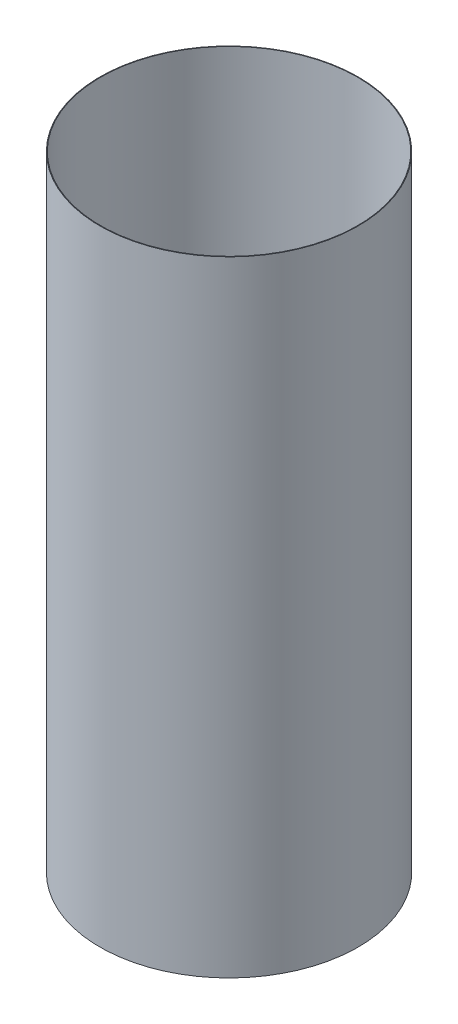
ISO-10303-21;
HEADER;
FILE_DESCRIPTION(('STEP AP214'),'2;1');
FILE_NAME('part.step','',(''),(''),'','','');
FILE_SCHEMA(('AUTOMOTIVE_DESIGN { 1 0 10303 214 1 1 1 1 }'));
ENDSEC;
DATA;
#1=APPLICATION_CONTEXT('core data for automotive mechanical design processes');
#2=APPLICATION_PROTOCOL_DEFINITION('international standard','automotive_design',2000,#1);
#3=PRODUCT_CONTEXT('',#1,'mechanical');
#4=PRODUCT('Part','Part','',(#3));
#5=PRODUCT_RELATED_PRODUCT_CATEGORY('part','',(#4));
#6=PRODUCT_DEFINITION_FORMATION('','',#4);
#7=PRODUCT_DEFINITION_CONTEXT('part definition',#1,'design');
#8=PRODUCT_DEFINITION('design','',#6,#7);
#9=PRODUCT_DEFINITION_SHAPE('','',#8);
#10=(LENGTH_UNIT() NAMED_UNIT(*) SI_UNIT(.MILLI.,.METRE.));
#11=(NAMED_UNIT(*) PLANE_ANGLE_UNIT() SI_UNIT($,.RADIAN.));
#12=(NAMED_UNIT(*) SI_UNIT($,.STERADIAN.) SOLID_ANGLE_UNIT());
#13=UNCERTAINTY_MEASURE_WITH_UNIT(LENGTH_MEASURE(1.E-05),#10,'distance_accuracy_value','');
#14=(GEOMETRIC_REPRESENTATION_CONTEXT(3) GLOBAL_UNCERTAINTY_ASSIGNED_CONTEXT((#13)) GLOBAL_UNIT_ASSIGNED_CONTEXT((#10,
#11,#12)) REPRESENTATION_CONTEXT('',''));
#15=CARTESIAN_POINT('',(0.,0.,0.));
#16=DIRECTION('',(0.,0.,1.));
#17=DIRECTION('',(1.,0.,0.));
#18=AXIS2_PLACEMENT_3D('',#15,#16,#17);
#19=CARTESIAN_POINT('',(0.,176.2125,0.));
#20=DIRECTION('',(0.,1.,0.));
#21=DIRECTION('',(0.,0.,1.));
#22=AXIS2_PLACEMENT_3D('',#19,#20,#21);
#23=PLANE('',#22);
#24=CARTESIAN_POINT('',(0.,176.2125,0.));
#25=DIRECTION('',(0.,1.,0.));
#26=DIRECTION('',(0.,0.,1.));
#27=AXIS2_PLACEMENT_3D('',#24,#25,#26);
#28=CIRCLE('',#27,36.449);
#29=CARTESIAN_POINT('',(0.,176.2125,-36.449));
#30=VERTEX_POINT('',#29);
#31=EDGE_CURVE('E10',#30,#30,#28,.T.);
#32=ORIENTED_EDGE('',*,*,#31,.T.);
#33=EDGE_LOOP('',(#32));
#34=FACE_BOUND('',#33,.T.);
#35=CARTESIAN_POINT('',(0.,176.2125,0.));
#36=DIRECTION('',(0.,1.,0.));
#37=DIRECTION('',(0.,0.,1.));
#38=AXIS2_PLACEMENT_3D('',#35,#36,#37);
#39=CIRCLE('',#38,36.2712);
#40=CARTESIAN_POINT('',(0.,176.2125,-36.2712));
#41=VERTEX_POINT('',#40);
#42=EDGE_CURVE('E42',#41,#41,#39,.T.);
#43=ORIENTED_EDGE('',*,*,#42,.F.);
#44=EDGE_LOOP('',(#43));
#45=FACE_BOUND('',#44,.T.);
#46=ADVANCED_FACE('F31',(#34,#45),#23,.T.);
#47=CARTESIAN_POINT('',(0.,0.,0.));
#48=DIRECTION('',(0.,1.,0.));
#49=DIRECTION('',(0.,0.,1.));
#50=AXIS2_PLACEMENT_3D('',#47,#48,#49);
#51=PLANE('',#50);
#52=CARTESIAN_POINT('',(0.,0.,0.));
#53=DIRECTION('',(0.,1.,0.));
#54=DIRECTION('',(0.,0.,1.));
#55=AXIS2_PLACEMENT_3D('',#52,#53,#54);
#56=CIRCLE('',#55,36.449);
#57=CARTESIAN_POINT('',(0.,0.,-36.449));
#58=VERTEX_POINT('',#57);
#59=EDGE_CURVE('E35',#58,#58,#56,.T.);
#60=ORIENTED_EDGE('',*,*,#59,.F.);
#61=EDGE_LOOP('',(#60));
#62=FACE_BOUND('',#61,.T.);
#63=CARTESIAN_POINT('',(0.,0.,0.));
#64=DIRECTION('',(0.,1.,0.));
#65=DIRECTION('',(0.,0.,1.));
#66=AXIS2_PLACEMENT_3D('',#63,#64,#65);
#67=CIRCLE('',#66,36.2712);
#68=CARTESIAN_POINT('',(0.,0.,-36.2712));
#69=VERTEX_POINT('',#68);
#70=EDGE_CURVE('E44',#69,#69,#67,.T.);
#71=ORIENTED_EDGE('',*,*,#70,.T.);
#72=EDGE_LOOP('',(#71));
#73=FACE_BOUND('',#72,.T.);
#74=ADVANCED_FACE('F54',(#62,#73),#51,.F.);
#75=CARTESIAN_POINT('',(0.,176.2125,0.));
#76=DIRECTION('',(0.,-1.,0.));
#77=DIRECTION('',(0.,0.,-1.));
#78=AXIS2_PLACEMENT_3D('',#75,#76,#77);
#79=CYLINDRICAL_SURFACE('',#78,36.449);
#80=CARTESIAN_POINT('',(0.,176.2125,-36.449));
#81=CARTESIAN_POINT('',(0.,174.376953125,-36.449));
#82=CARTESIAN_POINT('',(0.,172.54140625,-36.449));
#83=CARTESIAN_POINT('',(0.,168.8703125,-36.449));
#84=CARTESIAN_POINT('',(0.,167.034765625,-36.449));
#85=CARTESIAN_POINT('',(0.,163.363671875,-36.449));
#86=CARTESIAN_POINT('',(0.,161.528125,-36.449));
#87=CARTESIAN_POINT('',(0.,157.85703125,-36.449));
#88=CARTESIAN_POINT('',(0.,156.021484375,-36.449));
#89=CARTESIAN_POINT('',(0.,152.350390625,-36.449));
#90=CARTESIAN_POINT('',(0.,150.51484375,-36.449));
#91=CARTESIAN_POINT('',(0.,146.84375,-36.449));
#92=CARTESIAN_POINT('',(0.,145.008203125,-36.449));
#93=CARTESIAN_POINT('',(0.,141.337109375,-36.449));
#94=CARTESIAN_POINT('',(0.,139.5015625,-36.449));
#95=CARTESIAN_POINT('',(0.,135.83046875,-36.449));
#96=CARTESIAN_POINT('',(0.,133.994921875,-36.449));
#97=CARTESIAN_POINT('',(0.,130.323828125,-36.449));
#98=CARTESIAN_POINT('',(0.,128.48828125,-36.449));
#99=CARTESIAN_POINT('',(0.,124.8171875,-36.449));
#100=CARTESIAN_POINT('',(0.,122.981640625,-36.449));
#101=CARTESIAN_POINT('',(0.,119.310546875,-36.449));
#102=CARTESIAN_POINT('',(0.,117.475,-36.449));
#103=CARTESIAN_POINT('',(0.,113.80390625,-36.449));
#104=CARTESIAN_POINT('',(0.,111.968359375,-36.449));
#105=CARTESIAN_POINT('',(0.,108.297265625,-36.449));
#106=CARTESIAN_POINT('',(0.,106.46171875,-36.449));
#107=CARTESIAN_POINT('',(0.,102.790625,-36.449));
#108=CARTESIAN_POINT('',(0.,100.955078125,-36.449));
#109=CARTESIAN_POINT('',(0.,97.283984375,-36.449));
#110=CARTESIAN_POINT('',(0.,95.4484375,-36.449));
#111=CARTESIAN_POINT('',(0.,91.77734375,-36.449));
#112=CARTESIAN_POINT('',(0.,89.941796875,-36.449));
#113=CARTESIAN_POINT('',(0.,86.270703125,-36.449));
#114=CARTESIAN_POINT('',(0.,84.43515625,-36.449));
#115=CARTESIAN_POINT('',(0.,80.7640625,-36.449));
#116=CARTESIAN_POINT('',(0.,78.928515625,-36.449));
#117=CARTESIAN_POINT('',(0.,75.257421875,-36.449));
#118=CARTESIAN_POINT('',(0.,73.421875,-36.449));
#119=CARTESIAN_POINT('',(0.,69.75078125,-36.449));
#120=CARTESIAN_POINT('',(0.,67.915234375,-36.449));
#121=CARTESIAN_POINT('',(0.,64.244140625,-36.449));
#122=CARTESIAN_POINT('',(0.,62.40859375,-36.449));
#123=CARTESIAN_POINT('',(0.,58.7375,-36.449));
#124=CARTESIAN_POINT('',(0.,56.901953125,-36.449));
#125=CARTESIAN_POINT('',(0.,53.230859375,-36.449));
#126=CARTESIAN_POINT('',(0.,51.3953125,-36.449));
#127=CARTESIAN_POINT('',(0.,47.72421875,-36.449));
#128=CARTESIAN_POINT('',(0.,45.888671875,-36.449));
#129=CARTESIAN_POINT('',(0.,42.217578125,-36.449));
#130=CARTESIAN_POINT('',(0.,40.38203125,-36.449));
#131=CARTESIAN_POINT('',(0.,36.7109375,-36.449));
#132=CARTESIAN_POINT('',(0.,34.875390625,-36.449));
#133=CARTESIAN_POINT('',(0.,31.204296875,-36.449));
#134=CARTESIAN_POINT('',(0.,29.36875,-36.449));
#135=CARTESIAN_POINT('',(0.,25.69765625,-36.449));
#136=CARTESIAN_POINT('',(0.,23.862109375,-36.449));
#137=CARTESIAN_POINT('',(0.,20.191015625,-36.449));
#138=CARTESIAN_POINT('',(0.,18.35546875,-36.449));
#139=CARTESIAN_POINT('',(0.,14.684375,-36.449));
#140=CARTESIAN_POINT('',(0.,12.848828125,-36.449));
#141=CARTESIAN_POINT('',(0.,9.17773437499998,-36.449));
#142=CARTESIAN_POINT('',(0.,7.34218749999998,-36.449));
#143=CARTESIAN_POINT('',(0.,3.67109374999997,-36.449));
#144=CARTESIAN_POINT('',(0.,1.83554687499997,-36.449));
#145=CARTESIAN_POINT('',(0.,0.,-36.449));
#146=B_SPLINE_CURVE_WITH_KNOTS('',3,(#80,#81,#82,#83,#84,#85,#86,#87,#88,#89,#90,#91,#92,#93,
#94,#95,#96,#97,#98,#99,#100,#101,#102,#103,#104,#105,#106,#107,#108,#109,#110,#111,#112,#113,
#114,#115,#116,#117,#118,#119,#120,#121,#122,#123,#124,#125,#126,#127,#128,#129,#130,#131,#132,
#133,#134,#135,#136,#137,#138,#139,#140,#141,#142,#143,#144,#145),.UNSPECIFIED.,.F.,.F.,(4,2,2,
2,2,2,2,2,2,2,2,2,2,2,2,2,2,2,2,2,2,2,2,2,2,2,2,2,2,2,2,2,4),(0.,5.50664062499998,11.01328125,
16.519921875,22.0265625,27.533203125,33.03984375,38.546484375,44.053125,49.559765625,
55.06640625,60.573046875,66.0796875,71.586328125,77.09296875,82.599609375,88.10625,93.612890625,
99.11953125,104.626171875,110.1328125,115.639453125,121.14609375,126.652734375,132.159375,
137.666015625,143.17265625,148.679296875,154.1859375,159.692578125,165.19921875,170.705859375,
176.2125),.UNSPECIFIED.);
#147=EDGE_CURVE('BSEAM33',#30,#58,#146,.T.);
#148=ORIENTED_EDGE('',*,*,#31,.F.);
#149=ORIENTED_EDGE('',*,*,#59,.T.);
#150=ORIENTED_EDGE('',*,*,#147,.T.);
#151=ORIENTED_EDGE('',*,*,#147,.F.);
#152=EDGE_LOOP('',(#148,#150,#149,#151));
#153=FACE_BOUND('',#152,.T.);
#154=ADVANCED_FACE('F33',(#153),#79,.T.);
#155=CARTESIAN_POINT('',(0.,176.2125,0.));
#156=DIRECTION('',(0.,-1.,0.));
#157=DIRECTION('',(0.,0.,-1.));
#158=AXIS2_PLACEMENT_3D('',#155,#156,#157);
#159=CYLINDRICAL_SURFACE('',#158,36.2712);
#160=CARTESIAN_POINT('',(0.,176.2125,-36.2712));
#161=CARTESIAN_POINT('',(0.,174.376953125,-36.2712));
#162=CARTESIAN_POINT('',(0.,172.54140625,-36.2712));
#163=CARTESIAN_POINT('',(0.,168.8703125,-36.2712));
#164=CARTESIAN_POINT('',(0.,167.034765625,-36.2712));
#165=CARTESIAN_POINT('',(0.,163.363671875,-36.2712));
#166=CARTESIAN_POINT('',(0.,161.528125,-36.2712));
#167=CARTESIAN_POINT('',(0.,157.85703125,-36.2712));
#168=CARTESIAN_POINT('',(0.,156.021484375,-36.2712));
#169=CARTESIAN_POINT('',(0.,152.350390625,-36.2712));
#170=CARTESIAN_POINT('',(0.,150.51484375,-36.2712));
#171=CARTESIAN_POINT('',(0.,146.84375,-36.2712));
#172=CARTESIAN_POINT('',(0.,145.008203125,-36.2712));
#173=CARTESIAN_POINT('',(0.,141.337109375,-36.2712));
#174=CARTESIAN_POINT('',(0.,139.5015625,-36.2712));
#175=CARTESIAN_POINT('',(0.,135.83046875,-36.2712));
#176=CARTESIAN_POINT('',(0.,133.994921875,-36.2712));
#177=CARTESIAN_POINT('',(0.,130.323828125,-36.2712));
#178=CARTESIAN_POINT('',(0.,128.48828125,-36.2712));
#179=CARTESIAN_POINT('',(0.,124.8171875,-36.2712));
#180=CARTESIAN_POINT('',(0.,122.981640625,-36.2712));
#181=CARTESIAN_POINT('',(0.,119.310546875,-36.2712));
#182=CARTESIAN_POINT('',(0.,117.475,-36.2712));
#183=CARTESIAN_POINT('',(0.,113.80390625,-36.2712));
#184=CARTESIAN_POINT('',(0.,111.968359375,-36.2712));
#185=CARTESIAN_POINT('',(0.,108.297265625,-36.2712));
#186=CARTESIAN_POINT('',(0.,106.46171875,-36.2712));
#187=CARTESIAN_POINT('',(0.,102.790625,-36.2712));
#188=CARTESIAN_POINT('',(0.,100.955078125,-36.2712));
#189=CARTESIAN_POINT('',(0.,97.283984375,-36.2712));
#190=CARTESIAN_POINT('',(0.,95.4484375,-36.2712));
#191=CARTESIAN_POINT('',(0.,91.77734375,-36.2712));
#192=CARTESIAN_POINT('',(0.,89.941796875,-36.2712));
#193=CARTESIAN_POINT('',(0.,86.270703125,-36.2712));
#194=CARTESIAN_POINT('',(0.,84.43515625,-36.2712));
#195=CARTESIAN_POINT('',(0.,80.7640625,-36.2712));
#196=CARTESIAN_POINT('',(0.,78.928515625,-36.2712));
#197=CARTESIAN_POINT('',(0.,75.257421875,-36.2712));
#198=CARTESIAN_POINT('',(0.,73.421875,-36.2712));
#199=CARTESIAN_POINT('',(0.,69.75078125,-36.2712));
#200=CARTESIAN_POINT('',(0.,67.915234375,-36.2712));
#201=CARTESIAN_POINT('',(0.,64.244140625,-36.2712));
#202=CARTESIAN_POINT('',(0.,62.40859375,-36.2712));
#203=CARTESIAN_POINT('',(0.,58.7375,-36.2712));
#204=CARTESIAN_POINT('',(0.,56.901953125,-36.2712));
#205=CARTESIAN_POINT('',(0.,53.230859375,-36.2712));
#206=CARTESIAN_POINT('',(0.,51.3953125,-36.2712));
#207=CARTESIAN_POINT('',(0.,47.72421875,-36.2712));
#208=CARTESIAN_POINT('',(0.,45.888671875,-36.2712));
#209=CARTESIAN_POINT('',(0.,42.217578125,-36.2712));
#210=CARTESIAN_POINT('',(0.,40.38203125,-36.2712));
#211=CARTESIAN_POINT('',(0.,36.7109375,-36.2712));
#212=CARTESIAN_POINT('',(0.,34.875390625,-36.2712));
#213=CARTESIAN_POINT('',(0.,31.204296875,-36.2712));
#214=CARTESIAN_POINT('',(0.,29.36875,-36.2712));
#215=CARTESIAN_POINT('',(0.,25.69765625,-36.2712));
#216=CARTESIAN_POINT('',(0.,23.862109375,-36.2712));
#217=CARTESIAN_POINT('',(0.,20.191015625,-36.2712));
#218=CARTESIAN_POINT('',(0.,18.35546875,-36.2712));
#219=CARTESIAN_POINT('',(0.,14.684375,-36.2712));
#220=CARTESIAN_POINT('',(0.,12.848828125,-36.2712));
#221=CARTESIAN_POINT('',(0.,9.17773437499998,-36.2712));
#222=CARTESIAN_POINT('',(0.,7.34218749999998,-36.2712));
#223=CARTESIAN_POINT('',(0.,3.67109374999997,-36.2712));
#224=CARTESIAN_POINT('',(0.,1.83554687499997,-36.2712));
#225=CARTESIAN_POINT('',(0.,0.,-36.2712));
#226=B_SPLINE_CURVE_WITH_KNOTS('',3,(#160,#161,#162,#163,#164,#165,#166,#167,#168,#169,#170,
#171,#172,#173,#174,#175,#176,#177,#178,#179,#180,#181,#182,#183,#184,#185,#186,#187,#188,#189,
#190,#191,#192,#193,#194,#195,#196,#197,#198,#199,#200,#201,#202,#203,#204,#205,#206,#207,#208,
#209,#210,#211,#212,#213,#214,#215,#216,#217,#218,#219,#220,#221,#222,#223,#224,#225),
.UNSPECIFIED.,.F.,.F.,(4,2,2,2,2,2,2,2,2,2,2,2,2,2,2,2,2,2,2,2,2,2,2,2,2,2,2,2,2,2,2,2,4),(0.,
5.50664062499998,11.01328125,16.519921875,22.0265625,27.533203125,33.03984375,38.546484375,
44.053125,49.559765625,55.06640625,60.573046875,66.0796875,71.586328125,77.09296875,
82.599609375,88.10625,93.612890625,99.11953125,104.626171875,110.1328125,115.639453125,
121.14609375,126.652734375,132.159375,137.666015625,143.17265625,148.679296875,154.1859375,
159.692578125,165.19921875,170.705859375,176.2125),.UNSPECIFIED.);
#227=EDGE_CURVE('BSEAM50',#41,#69,#226,.T.);
#228=ORIENTED_EDGE('',*,*,#42,.T.);
#229=ORIENTED_EDGE('',*,*,#70,.F.);
#230=ORIENTED_EDGE('',*,*,#227,.T.);
#231=ORIENTED_EDGE('',*,*,#227,.F.);
#232=EDGE_LOOP('',(#228,#230,#229,#231));
#233=FACE_BOUND('',#232,.T.);
#234=ADVANCED_FACE('F50',(#233),#159,.F.);
#235=CLOSED_SHELL('',(#46,#74,#154,#234));
#236=MANIFOLD_SOLID_BREP('B2',#235);
#237=ADVANCED_BREP_SHAPE_REPRESENTATION('',(#18,#236),#14);
#238=SHAPE_DEFINITION_REPRESENTATION(#9,#237);
ENDSEC;
END-ISO-10303-21;
